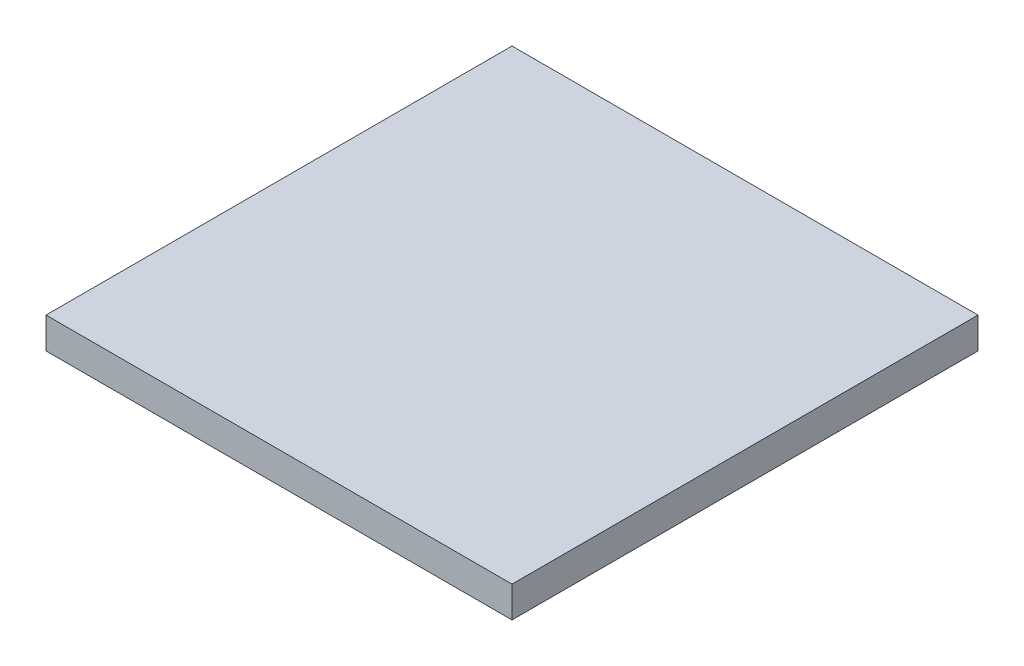
ISO-10303-21;
HEADER;
FILE_DESCRIPTION(('STEP AP214'),'2;1');
FILE_NAME('part.step','',(''),(''),'','','');
FILE_SCHEMA(('AUTOMOTIVE_DESIGN { 1 0 10303 214 1 1 1 1 }'));
ENDSEC;
DATA;
#1=APPLICATION_CONTEXT('core data for automotive mechanical design processes');
#2=APPLICATION_PROTOCOL_DEFINITION('international standard','automotive_design',2000,#1);
#3=PRODUCT_CONTEXT('',#1,'mechanical');
#4=PRODUCT('Part','Part','',(#3));
#5=PRODUCT_RELATED_PRODUCT_CATEGORY('part','',(#4));
#6=PRODUCT_DEFINITION_FORMATION('','',#4);
#7=PRODUCT_DEFINITION_CONTEXT('part definition',#1,'design');
#8=PRODUCT_DEFINITION('design','',#6,#7);
#9=PRODUCT_DEFINITION_SHAPE('','',#8);
#10=(LENGTH_UNIT() NAMED_UNIT(*) SI_UNIT(.MILLI.,.METRE.));
#11=(NAMED_UNIT(*) PLANE_ANGLE_UNIT() SI_UNIT($,.RADIAN.));
#12=(NAMED_UNIT(*) SI_UNIT($,.STERADIAN.) SOLID_ANGLE_UNIT());
#13=UNCERTAINTY_MEASURE_WITH_UNIT(LENGTH_MEASURE(1.E-05),#10,'distance_accuracy_value','');
#14=(GEOMETRIC_REPRESENTATION_CONTEXT(3) GLOBAL_UNCERTAINTY_ASSIGNED_CONTEXT((#13)) GLOBAL_UNIT_ASSIGNED_CONTEXT((#10,
#11,#12)) REPRESENTATION_CONTEXT('',''));
#15=CARTESIAN_POINT('',(0.,0.,0.));
#16=DIRECTION('',(0.,0.,1.));
#17=DIRECTION('',(1.,0.,0.));
#18=AXIS2_PLACEMENT_3D('',#15,#16,#17);
#19=CARTESIAN_POINT('',(0.,1.,0.));
#20=DIRECTION('',(1.,0.,0.));
#21=DIRECTION('',(0.,0.,-1.));
#22=AXIS2_PLACEMENT_3D('',#19,#20,#21);
#23=PLANE('',#22);
#24=DIRECTION('',(0.,0.,1.));
#25=VECTOR('',#24,1.);
#26=CARTESIAN_POINT('',(0.,0.,0.));
#27=LINE('',#26,#25);
#28=CARTESIAN_POINT('',(0.,0.,-15.));
#29=VERTEX_POINT('',#28);
#30=CARTESIAN_POINT('',(0.,0.,0.));
#31=VERTEX_POINT('',#30);
#32=EDGE_CURVE('E102',#29,#31,#27,.T.);
#33=ORIENTED_EDGE('',*,*,#32,.T.);
#34=DIRECTION('',(0.,-1.,0.));
#35=VECTOR('',#34,1.);
#36=CARTESIAN_POINT('',(0.,1.,0.));
#37=LINE('',#36,#35);
#38=CARTESIAN_POINT('',(0.,1.,0.));
#39=VERTEX_POINT('',#38);
#40=EDGE_CURVE('E11',#39,#31,#37,.T.);
#41=ORIENTED_EDGE('',*,*,#40,.F.);
#42=DIRECTION('',(0.,0.,1.));
#43=VECTOR('',#42,1.);
#44=CARTESIAN_POINT('',(0.,1.,0.));
#45=LINE('',#44,#43);
#46=CARTESIAN_POINT('',(0.,1.,-15.));
#47=VERTEX_POINT('',#46);
#48=EDGE_CURVE('E90',#47,#39,#45,.T.);
#49=ORIENTED_EDGE('',*,*,#48,.F.);
#50=DIRECTION('',(0.,-1.,0.));
#51=VECTOR('',#50,1.);
#52=CARTESIAN_POINT('',(0.,1.,-15.));
#53=LINE('',#52,#51);
#54=EDGE_CURVE('E98',#47,#29,#53,.T.);
#55=ORIENTED_EDGE('',*,*,#54,.T.);
#56=EDGE_LOOP('',(#33,#41,#49,#55));
#57=FACE_BOUND('',#56,.T.);
#58=ADVANCED_FACE('F39',(#57),#23,.F.);
#59=CARTESIAN_POINT('',(0.,1.,0.));
#60=DIRECTION('',(0.,0.,-1.));
#61=DIRECTION('',(-1.,0.,0.));
#62=AXIS2_PLACEMENT_3D('',#59,#60,#61);
#63=PLANE('',#62);
#64=DIRECTION('',(1.,0.,0.));
#65=VECTOR('',#64,1.);
#66=CARTESIAN_POINT('',(0.,0.,0.));
#67=LINE('',#66,#65);
#68=CARTESIAN_POINT('',(15.,0.,0.));
#69=VERTEX_POINT('',#68);
#70=EDGE_CURVE('E94',#31,#69,#67,.T.);
#71=ORIENTED_EDGE('',*,*,#70,.T.);
#72=DIRECTION('',(0.,-1.,0.));
#73=VECTOR('',#72,1.);
#74=CARTESIAN_POINT('',(15.,1.,0.));
#75=LINE('',#74,#73);
#76=CARTESIAN_POINT('',(15.,1.,0.));
#77=VERTEX_POINT('',#76);
#78=EDGE_CURVE('E47',#77,#69,#75,.T.);
#79=ORIENTED_EDGE('',*,*,#78,.F.);
#80=DIRECTION('',(1.,0.,0.));
#81=VECTOR('',#80,1.);
#82=CARTESIAN_POINT('',(0.,1.,0.));
#83=LINE('',#82,#81);
#84=EDGE_CURVE('E85',#39,#77,#83,.T.);
#85=ORIENTED_EDGE('',*,*,#84,.F.);
#86=ORIENTED_EDGE('',*,*,#40,.T.);
#87=EDGE_LOOP('',(#71,#79,#85,#86));
#88=FACE_BOUND('',#87,.T.);
#89=ADVANCED_FACE('F93',(#88),#63,.F.);
#90=CARTESIAN_POINT('',(15.,1.,0.));
#91=DIRECTION('',(-1.,0.,0.));
#92=DIRECTION('',(0.,0.,1.));
#93=AXIS2_PLACEMENT_3D('',#90,#91,#92);
#94=PLANE('',#93);
#95=DIRECTION('',(0.,0.,-1.));
#96=VECTOR('',#95,1.);
#97=CARTESIAN_POINT('',(15.,0.,0.));
#98=LINE('',#97,#96);
#99=CARTESIAN_POINT('',(15.,0.,-15.));
#100=VERTEX_POINT('',#99);
#101=EDGE_CURVE('E72',#69,#100,#98,.T.);
#102=ORIENTED_EDGE('',*,*,#101,.T.);
#103=DIRECTION('',(0.,-1.,0.));
#104=VECTOR('',#103,1.);
#105=CARTESIAN_POINT('',(15.,1.,-15.));
#106=LINE('',#105,#104);
#107=CARTESIAN_POINT('',(15.,1.,-15.));
#108=VERTEX_POINT('',#107);
#109=EDGE_CURVE('E95',#108,#100,#106,.T.);
#110=ORIENTED_EDGE('',*,*,#109,.F.);
#111=DIRECTION('',(0.,0.,-1.));
#112=VECTOR('',#111,1.);
#113=CARTESIAN_POINT('',(15.,1.,0.));
#114=LINE('',#113,#112);
#115=EDGE_CURVE('E88',#77,#108,#114,.T.);
#116=ORIENTED_EDGE('',*,*,#115,.F.);
#117=ORIENTED_EDGE('',*,*,#78,.T.);
#118=EDGE_LOOP('',(#102,#110,#116,#117));
#119=FACE_BOUND('',#118,.T.);
#120=ADVANCED_FACE('F96',(#119),#94,.F.);
#121=CARTESIAN_POINT('',(0.,1.,-15.));
#122=DIRECTION('',(0.,0.,1.));
#123=DIRECTION('',(1.,0.,0.));
#124=AXIS2_PLACEMENT_3D('',#121,#122,#123);
#125=PLANE('',#124);
#126=DIRECTION('',(-1.,0.,0.));
#127=VECTOR('',#126,1.);
#128=CARTESIAN_POINT('',(0.,0.,-15.));
#129=LINE('',#128,#127);
#130=EDGE_CURVE('E78',#100,#29,#129,.T.);
#131=ORIENTED_EDGE('',*,*,#130,.T.);
#132=ORIENTED_EDGE('',*,*,#54,.F.);
#133=DIRECTION('',(-1.,0.,0.));
#134=VECTOR('',#133,1.);
#135=CARTESIAN_POINT('',(0.,1.,-15.));
#136=LINE('',#135,#134);
#137=EDGE_CURVE('E55',#108,#47,#136,.T.);
#138=ORIENTED_EDGE('',*,*,#137,.F.);
#139=ORIENTED_EDGE('',*,*,#109,.T.);
#140=EDGE_LOOP('',(#131,#132,#138,#139));
#141=FACE_BOUND('',#140,.T.);
#142=ADVANCED_FACE('F109',(#141),#125,.F.);
#143=CARTESIAN_POINT('',(0.,1.,0.));
#144=DIRECTION('',(0.,-1.,0.));
#145=DIRECTION('',(0.,0.,-1.));
#146=AXIS2_PLACEMENT_3D('',#143,#144,#145);
#147=PLANE('',#146);
#148=ORIENTED_EDGE('',*,*,#48,.T.);
#149=ORIENTED_EDGE('',*,*,#84,.T.);
#150=ORIENTED_EDGE('',*,*,#115,.T.);
#151=ORIENTED_EDGE('',*,*,#137,.T.);
#152=EDGE_LOOP('',(#148,#149,#150,#151));
#153=FACE_BOUND('',#152,.T.);
#154=ADVANCED_FACE('F86',(#153),#147,.F.);
#155=CARTESIAN_POINT('',(0.,0.,0.));
#156=DIRECTION('',(0.,-1.,0.));
#157=DIRECTION('',(0.,0.,-1.));
#158=AXIS2_PLACEMENT_3D('',#155,#156,#157);
#159=PLANE('',#158);
#160=ORIENTED_EDGE('',*,*,#32,.F.);
#161=ORIENTED_EDGE('',*,*,#130,.F.);
#162=ORIENTED_EDGE('',*,*,#101,.F.);
#163=ORIENTED_EDGE('',*,*,#70,.F.);
#164=EDGE_LOOP('',(#160,#161,#162,#163));
#165=FACE_BOUND('',#164,.T.);
#166=ADVANCED_FACE('F112',(#165),#159,.T.);
#167=CLOSED_SHELL('',(#58,#89,#120,#142,#154,#166));
#168=MANIFOLD_SOLID_BREP('B2',#167);
#169=ADVANCED_BREP_SHAPE_REPRESENTATION('',(#18,#168),#14);
#170=SHAPE_DEFINITION_REPRESENTATION(#9,#169);
ENDSEC;
END-ISO-10303-21;
